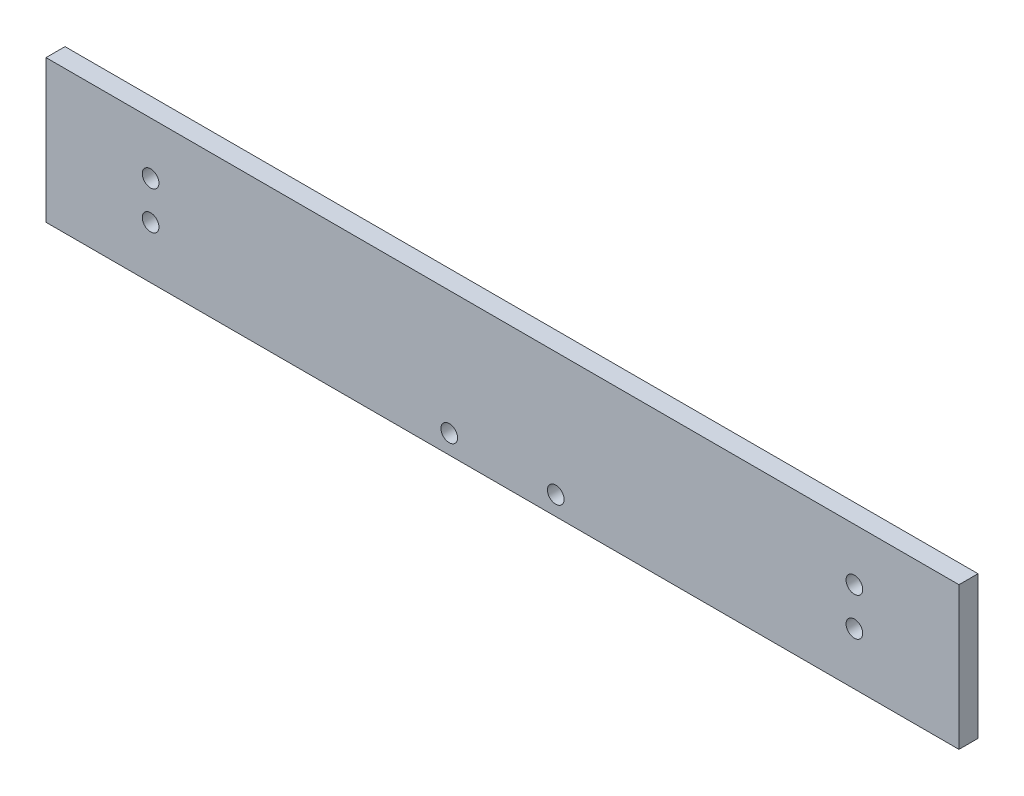
ISO-10303-21;
HEADER;
FILE_DESCRIPTION(('STEP AP214'),'2;1');
FILE_NAME('part.step','',(''),(''),'','','');
FILE_SCHEMA(('AUTOMOTIVE_DESIGN { 1 0 10303 214 1 1 1 1 }'));
ENDSEC;
DATA;
#1=APPLICATION_CONTEXT('core data for automotive mechanical design processes');
#2=APPLICATION_PROTOCOL_DEFINITION('international standard','automotive_design',2000,#1);
#3=PRODUCT_CONTEXT('',#1,'mechanical');
#4=PRODUCT('Part','Part','',(#3));
#5=PRODUCT_RELATED_PRODUCT_CATEGORY('part','',(#4));
#6=PRODUCT_DEFINITION_FORMATION('','',#4);
#7=PRODUCT_DEFINITION_CONTEXT('part definition',#1,'design');
#8=PRODUCT_DEFINITION('design','',#6,#7);
#9=PRODUCT_DEFINITION_SHAPE('','',#8);
#10=(LENGTH_UNIT() NAMED_UNIT(*) SI_UNIT(.MILLI.,.METRE.));
#11=(NAMED_UNIT(*) PLANE_ANGLE_UNIT() SI_UNIT($,.RADIAN.));
#12=(NAMED_UNIT(*) SI_UNIT($,.STERADIAN.) SOLID_ANGLE_UNIT());
#13=UNCERTAINTY_MEASURE_WITH_UNIT(LENGTH_MEASURE(1.E-05),#10,'distance_accuracy_value','');
#14=(GEOMETRIC_REPRESENTATION_CONTEXT(3) GLOBAL_UNCERTAINTY_ASSIGNED_CONTEXT((#13)) GLOBAL_UNIT_ASSIGNED_CONTEXT((#10,
#11,#12)) REPRESENTATION_CONTEXT('',''));
#15=CARTESIAN_POINT('',(0.,0.,0.));
#16=DIRECTION('',(0.,0.,1.));
#17=DIRECTION('',(1.,0.,0.));
#18=AXIS2_PLACEMENT_3D('',#15,#16,#17);
#19=CARTESIAN_POINT('',(-91.3947659491775,0.,4.));
#20=DIRECTION('',(-1.,0.,0.));
#21=DIRECTION('',(0.,0.,1.));
#22=AXIS2_PLACEMENT_3D('',#19,#20,#21);
#23=PLANE('',#22);
#24=DIRECTION('',(0.,1.,0.));
#25=VECTOR('',#24,1.);
#26=CARTESIAN_POINT('',(-91.3947659491775,0.,0.));
#27=LINE('',#26,#25);
#28=CARTESIAN_POINT('',(-91.3947659491775,-16.7611849929289,0.));
#29=VERTEX_POINT('',#28);
#30=CARTESIAN_POINT('',(-91.3947659491775,13.2388150070711,0.));
#31=VERTEX_POINT('',#30);
#32=EDGE_CURVE('E116',#29,#31,#27,.T.);
#33=ORIENTED_EDGE('',*,*,#32,.F.);
#34=DIRECTION('',(0.,0.,-1.));
#35=VECTOR('',#34,1.);
#36=CARTESIAN_POINT('',(-91.3947659491775,-16.7611849929289,4.));
#37=LINE('',#36,#35);
#38=CARTESIAN_POINT('',(-91.3947659491775,-16.7611849929289,4.));
#39=VERTEX_POINT('',#38);
#40=EDGE_CURVE('E11',#39,#29,#37,.T.);
#41=ORIENTED_EDGE('',*,*,#40,.F.);
#42=DIRECTION('',(0.,1.,0.));
#43=VECTOR('',#42,1.);
#44=CARTESIAN_POINT('',(-91.3947659491775,0.,4.));
#45=LINE('',#44,#43);
#46=CARTESIAN_POINT('',(-91.3947659491775,13.2388150070711,4.));
#47=VERTEX_POINT('',#46);
#48=EDGE_CURVE('E86',#39,#47,#45,.T.);
#49=ORIENTED_EDGE('',*,*,#48,.T.);
#50=DIRECTION('',(0.,0.,-1.));
#51=VECTOR('',#50,1.);
#52=CARTESIAN_POINT('',(-91.3947659491775,13.2388150070711,4.));
#53=LINE('',#52,#51);
#54=EDGE_CURVE('E74',#47,#31,#53,.T.);
#55=ORIENTED_EDGE('',*,*,#54,.T.);
#56=EDGE_LOOP('',(#33,#41,#49,#55));
#57=FACE_BOUND('',#56,.T.);
#58=ADVANCED_FACE('F35',(#57),#23,.T.);
#59=CARTESIAN_POINT('',(0.,-16.7611849929289,4.));
#60=DIRECTION('',(0.,1.,0.));
#61=DIRECTION('',(-1.,0.,0.));
#62=AXIS2_PLACEMENT_3D('',#59,#60,#61);
#63=PLANE('',#62);
#64=DIRECTION('',(1.,0.,0.));
#65=VECTOR('',#64,1.);
#66=CARTESIAN_POINT('',(0.,-16.7611849929289,0.));
#67=LINE('',#66,#65);
#68=CARTESIAN_POINT('',(100.605234050822,-16.7611849929288,0.));
#69=VERTEX_POINT('',#68);
#70=EDGE_CURVE('E91',#29,#69,#67,.T.);
#71=ORIENTED_EDGE('',*,*,#70,.T.);
#72=DIRECTION('',(0.,0.,-1.));
#73=VECTOR('',#72,1.);
#74=CARTESIAN_POINT('',(100.605234050822,-16.7611849929288,4.));
#75=LINE('',#74,#73);
#76=CARTESIAN_POINT('',(100.605234050822,-16.7611849929288,4.));
#77=VERTEX_POINT('',#76);
#78=EDGE_CURVE('E43',#77,#69,#75,.T.);
#79=ORIENTED_EDGE('',*,*,#78,.F.);
#80=DIRECTION('',(1.,0.,0.));
#81=VECTOR('',#80,1.);
#82=CARTESIAN_POINT('',(0.,-16.7611849929289,4.));
#83=LINE('',#82,#81);
#84=EDGE_CURVE('E80',#39,#77,#83,.T.);
#85=ORIENTED_EDGE('',*,*,#84,.F.);
#86=ORIENTED_EDGE('',*,*,#40,.T.);
#87=EDGE_LOOP('',(#71,#79,#85,#86));
#88=FACE_BOUND('',#87,.T.);
#89=ADVANCED_FACE('F89',(#88),#63,.F.);
#90=CARTESIAN_POINT('',(100.605234050822,0.,4.));
#91=DIRECTION('',(-1.,0.,0.));
#92=DIRECTION('',(0.,0.,1.));
#93=AXIS2_PLACEMENT_3D('',#90,#91,#92);
#94=PLANE('',#93);
#95=DIRECTION('',(0.,1.,0.));
#96=VECTOR('',#95,1.);
#97=CARTESIAN_POINT('',(100.605234050822,0.,0.));
#98=LINE('',#97,#96);
#99=CARTESIAN_POINT('',(100.605234050822,13.2388150070711,0.));
#100=VERTEX_POINT('',#99);
#101=EDGE_CURVE('E67',#69,#100,#98,.T.);
#102=ORIENTED_EDGE('',*,*,#101,.T.);
#103=DIRECTION('',(0.,0.,-1.));
#104=VECTOR('',#103,1.);
#105=CARTESIAN_POINT('',(100.605234050822,13.2388150070711,4.));
#106=LINE('',#105,#104);
#107=CARTESIAN_POINT('',(100.605234050822,13.2388150070711,4.));
#108=VERTEX_POINT('',#107);
#109=EDGE_CURVE('E92',#108,#100,#106,.T.);
#110=ORIENTED_EDGE('',*,*,#109,.F.);
#111=DIRECTION('',(0.,1.,0.));
#112=VECTOR('',#111,1.);
#113=CARTESIAN_POINT('',(100.605234050822,0.,4.));
#114=LINE('',#113,#112);
#115=EDGE_CURVE('E85',#77,#108,#114,.T.);
#116=ORIENTED_EDGE('',*,*,#115,.F.);
#117=ORIENTED_EDGE('',*,*,#78,.T.);
#118=EDGE_LOOP('',(#102,#110,#116,#117));
#119=FACE_BOUND('',#118,.T.);
#120=ADVANCED_FACE('F93',(#119),#94,.F.);
#121=CARTESIAN_POINT('',(15.8052340508226,-12.7611849929288,4.));
#122=DIRECTION('',(0.,0.,-1.));
#123=DIRECTION('',(-1.,0.,0.));
#124=AXIS2_PLACEMENT_3D('',#121,#122,#123);
#125=CYLINDRICAL_SURFACE('',#124,1.75000000000001);
#126=CARTESIAN_POINT('',(15.8052340508226,-12.7611849929288,4.));
#127=DIRECTION('',(0.,0.,1.));
#128=DIRECTION('',(1.,0.,0.));
#129=AXIS2_PLACEMENT_3D('',#126,#127,#128);
#130=CIRCLE('',#129,1.75000000000001);
#131=CARTESIAN_POINT('',(17.5552340508226,-12.7611849929288,4.));
#132=VERTEX_POINT('',#131);
#133=EDGE_CURVE('E110',#132,#132,#130,.T.);
#134=ORIENTED_EDGE('',*,*,#133,.T.);
#135=EDGE_LOOP('',(#134));
#136=FACE_BOUND('',#135,.T.);
#137=CARTESIAN_POINT('',(15.8052340508226,-12.7611849929288,0.));
#138=DIRECTION('',(0.,0.,1.));
#139=DIRECTION('',(1.,0.,0.));
#140=AXIS2_PLACEMENT_3D('',#137,#138,#139);
#141=CIRCLE('',#140,1.75000000000001);
#142=CARTESIAN_POINT('',(17.5552340508226,-12.7611849929288,0.));
#143=VERTEX_POINT('',#142);
#144=EDGE_CURVE('E135',#143,#143,#141,.T.);
#145=ORIENTED_EDGE('',*,*,#144,.F.);
#146=EDGE_LOOP('',(#145));
#147=FACE_BOUND('',#146,.T.);
#148=ADVANCED_FACE('F155',(#136,#147),#125,.F.);
#149=CARTESIAN_POINT('',(-69.3947659491773,2.23881500707113,4.));
#150=DIRECTION('',(0.,0.,-1.));
#151=DIRECTION('',(-1.,0.,0.));
#152=AXIS2_PLACEMENT_3D('',#149,#150,#151);
#153=CYLINDRICAL_SURFACE('',#152,1.74999999999998);
#154=CARTESIAN_POINT('',(-69.3947659491773,2.23881500707113,4.));
#155=DIRECTION('',(0.,0.,1.));
#156=DIRECTION('',(1.,0.,0.));
#157=AXIS2_PLACEMENT_3D('',#154,#155,#156);
#158=CIRCLE('',#157,1.74999999999998);
#159=CARTESIAN_POINT('',(-67.6447659491774,2.23881500707113,4.));
#160=VERTEX_POINT('',#159);
#161=EDGE_CURVE('E107',#160,#160,#158,.F.);
#162=ORIENTED_EDGE('',*,*,#161,.F.);
#163=EDGE_LOOP('',(#162));
#164=FACE_BOUND('',#163,.T.);
#165=CARTESIAN_POINT('',(-69.3947659491773,2.23881500707113,0.));
#166=DIRECTION('',(0.,0.,1.));
#167=DIRECTION('',(1.,0.,0.));
#168=AXIS2_PLACEMENT_3D('',#165,#166,#167);
#169=CIRCLE('',#168,1.74999999999998);
#170=CARTESIAN_POINT('',(-67.6447659491774,2.23881500707113,0.));
#171=VERTEX_POINT('',#170);
#172=EDGE_CURVE('E132',#171,#171,#169,.F.);
#173=ORIENTED_EDGE('',*,*,#172,.T.);
#174=EDGE_LOOP('',(#173));
#175=FACE_BOUND('',#174,.T.);
#176=ADVANCED_FACE('F172',(#164,#175),#153,.F.);
#177=CARTESIAN_POINT('',(78.6052340508225,-5.76118499292888,4.));
#178=DIRECTION('',(0.,0.,-1.));
#179=DIRECTION('',(-1.,0.,0.));
#180=AXIS2_PLACEMENT_3D('',#177,#178,#179);
#181=CYLINDRICAL_SURFACE('',#180,1.74999999999998);
#182=CARTESIAN_POINT('',(78.6052340508225,-5.76118499292888,4.));
#183=DIRECTION('',(0.,0.,1.));
#184=DIRECTION('',(1.,0.,0.));
#185=AXIS2_PLACEMENT_3D('',#182,#183,#184);
#186=CIRCLE('',#185,1.74999999999998);
#187=CARTESIAN_POINT('',(80.3552340508224,-5.76118499292888,4.));
#188=VERTEX_POINT('',#187);
#189=EDGE_CURVE('E104',#188,#188,#186,.T.);
#190=ORIENTED_EDGE('',*,*,#189,.T.);
#191=EDGE_LOOP('',(#190));
#192=FACE_BOUND('',#191,.T.);
#193=CARTESIAN_POINT('',(78.6052340508225,-5.76118499292888,0.));
#194=DIRECTION('',(0.,0.,1.));
#195=DIRECTION('',(1.,0.,0.));
#196=AXIS2_PLACEMENT_3D('',#193,#194,#195);
#197=CIRCLE('',#196,1.74999999999998);
#198=CARTESIAN_POINT('',(80.3552340508224,-5.76118499292888,0.));
#199=VERTEX_POINT('',#198);
#200=EDGE_CURVE('E129',#199,#199,#197,.T.);
#201=ORIENTED_EDGE('',*,*,#200,.F.);
#202=EDGE_LOOP('',(#201));
#203=FACE_BOUND('',#202,.T.);
#204=ADVANCED_FACE('F168',(#192,#203),#181,.F.);
#205=CARTESIAN_POINT('',(78.6052340508225,2.23881500707113,4.));
#206=DIRECTION('',(0.,0.,-1.));
#207=DIRECTION('',(-1.,0.,0.));
#208=AXIS2_PLACEMENT_3D('',#205,#206,#207);
#209=CYLINDRICAL_SURFACE('',#208,1.74999999999998);
#210=CARTESIAN_POINT('',(78.6052340508225,2.23881500707113,4.));
#211=DIRECTION('',(0.,0.,1.));
#212=DIRECTION('',(1.,0.,0.));
#213=AXIS2_PLACEMENT_3D('',#210,#211,#212);
#214=CIRCLE('',#213,1.74999999999998);
#215=CARTESIAN_POINT('',(80.3552340508224,2.23881500707113,4.));
#216=VERTEX_POINT('',#215);
#217=EDGE_CURVE('E101',#216,#216,#214,.T.);
#218=ORIENTED_EDGE('',*,*,#217,.T.);
#219=EDGE_LOOP('',(#218));
#220=FACE_BOUND('',#219,.T.);
#221=CARTESIAN_POINT('',(78.6052340508225,2.23881500707113,0.));
#222=DIRECTION('',(0.,0.,1.));
#223=DIRECTION('',(1.,0.,0.));
#224=AXIS2_PLACEMENT_3D('',#221,#222,#223);
#225=CIRCLE('',#224,1.74999999999998);
#226=CARTESIAN_POINT('',(80.3552340508224,2.23881500707113,0.));
#227=VERTEX_POINT('',#226);
#228=EDGE_CURVE('E126',#227,#227,#225,.T.);
#229=ORIENTED_EDGE('',*,*,#228,.F.);
#230=EDGE_LOOP('',(#229));
#231=FACE_BOUND('',#230,.T.);
#232=ADVANCED_FACE('F164',(#220,#231),#209,.F.);
#233=CARTESIAN_POINT('',(-69.3947659491773,-5.76118499292888,4.));
#234=DIRECTION('',(0.,0.,-1.));
#235=DIRECTION('',(-1.,0.,0.));
#236=AXIS2_PLACEMENT_3D('',#233,#234,#235);
#237=CYLINDRICAL_SURFACE('',#236,1.74999999999998);
#238=CARTESIAN_POINT('',(-69.3947659491773,-5.76118499292888,4.));
#239=DIRECTION('',(0.,0.,1.));
#240=DIRECTION('',(1.,0.,0.));
#241=AXIS2_PLACEMENT_3D('',#238,#239,#240);
#242=CIRCLE('',#241,1.74999999999998);
#243=CARTESIAN_POINT('',(-67.6447659491774,-5.76118499292888,4.));
#244=VERTEX_POINT('',#243);
#245=EDGE_CURVE('E95',#244,#244,#242,.F.);
#246=ORIENTED_EDGE('',*,*,#245,.F.);
#247=EDGE_LOOP('',(#246));
#248=FACE_BOUND('',#247,.T.);
#249=CARTESIAN_POINT('',(-69.3947659491773,-5.76118499292888,0.));
#250=DIRECTION('',(0.,0.,1.));
#251=DIRECTION('',(1.,0.,0.));
#252=AXIS2_PLACEMENT_3D('',#249,#250,#251);
#253=CIRCLE('',#252,1.74999999999998);
#254=CARTESIAN_POINT('',(-67.6447659491774,-5.76118499292888,0.));
#255=VERTEX_POINT('',#254);
#256=EDGE_CURVE('E123',#255,#255,#253,.F.);
#257=ORIENTED_EDGE('',*,*,#256,.T.);
#258=EDGE_LOOP('',(#257));
#259=FACE_BOUND('',#258,.T.);
#260=ADVANCED_FACE('F161',(#248,#259),#237,.F.);
#261=CARTESIAN_POINT('',(0.,13.2388150070711,4.));
#262=DIRECTION('',(0.,-1.,0.));
#263=DIRECTION('',(1.,0.,0.));
#264=AXIS2_PLACEMENT_3D('',#261,#262,#263);
#265=PLANE('',#264);
#266=DIRECTION('',(-1.,0.,0.));
#267=VECTOR('',#266,1.);
#268=CARTESIAN_POINT('',(0.,13.2388150070711,0.));
#269=LINE('',#268,#267);
#270=EDGE_CURVE('E121',#100,#31,#269,.T.);
#271=ORIENTED_EDGE('',*,*,#270,.T.);
#272=ORIENTED_EDGE('',*,*,#54,.F.);
#273=DIRECTION('',(-1.,0.,0.));
#274=VECTOR('',#273,1.);
#275=CARTESIAN_POINT('',(0.,13.2388150070711,4.));
#276=LINE('',#275,#274);
#277=EDGE_CURVE('E51',#108,#47,#276,.T.);
#278=ORIENTED_EDGE('',*,*,#277,.F.);
#279=ORIENTED_EDGE('',*,*,#109,.T.);
#280=EDGE_LOOP('',(#271,#272,#278,#279));
#281=FACE_BOUND('',#280,.T.);
#282=ADVANCED_FACE('F144',(#281),#265,.F.);
#283=CARTESIAN_POINT('',(-6.59476594917741,-12.7611849929288,4.));
#284=DIRECTION('',(0.,0.,-1.));
#285=DIRECTION('',(-1.,0.,0.));
#286=AXIS2_PLACEMENT_3D('',#283,#284,#285);
#287=CYLINDRICAL_SURFACE('',#286,1.75);
#288=CARTESIAN_POINT('',(-6.59476594917741,-12.7611849929288,4.));
#289=DIRECTION('',(0.,0.,1.));
#290=DIRECTION('',(1.,0.,0.));
#291=AXIS2_PLACEMENT_3D('',#288,#289,#290);
#292=CIRCLE('',#291,1.75);
#293=CARTESIAN_POINT('',(-4.84476594917741,-12.7611849929288,4.));
#294=VERTEX_POINT('',#293);
#295=EDGE_CURVE('E113',#294,#294,#292,.T.);
#296=ORIENTED_EDGE('',*,*,#295,.T.);
#297=EDGE_LOOP('',(#296));
#298=FACE_BOUND('',#297,.T.);
#299=CARTESIAN_POINT('',(-6.59476594917741,-12.7611849929288,0.));
#300=DIRECTION('',(0.,0.,1.));
#301=DIRECTION('',(1.,0.,0.));
#302=AXIS2_PLACEMENT_3D('',#299,#300,#301);
#303=CIRCLE('',#302,1.75);
#304=CARTESIAN_POINT('',(-4.84476594917741,-12.7611849929288,0.));
#305=VERTEX_POINT('',#304);
#306=EDGE_CURVE('E138',#305,#305,#303,.T.);
#307=ORIENTED_EDGE('',*,*,#306,.F.);
#308=EDGE_LOOP('',(#307));
#309=FACE_BOUND('',#308,.T.);
#310=ADVANCED_FACE('F160',(#298,#309),#287,.F.);
#311=CARTESIAN_POINT('',(0.,0.,4.));
#312=DIRECTION('',(0.,0.,1.));
#313=DIRECTION('',(1.,0.,0.));
#314=AXIS2_PLACEMENT_3D('',#311,#312,#313);
#315=PLANE('',#314);
#316=ORIENTED_EDGE('',*,*,#48,.F.);
#317=ORIENTED_EDGE('',*,*,#84,.T.);
#318=ORIENTED_EDGE('',*,*,#115,.T.);
#319=ORIENTED_EDGE('',*,*,#277,.T.);
#320=EDGE_LOOP('',(#316,#317,#318,#319));
#321=FACE_BOUND('',#320,.T.);
#322=ORIENTED_EDGE('',*,*,#245,.T.);
#323=EDGE_LOOP('',(#322));
#324=FACE_BOUND('',#323,.T.);
#325=ORIENTED_EDGE('',*,*,#217,.F.);
#326=EDGE_LOOP('',(#325));
#327=FACE_BOUND('',#326,.T.);
#328=ORIENTED_EDGE('',*,*,#189,.F.);
#329=EDGE_LOOP('',(#328));
#330=FACE_BOUND('',#329,.T.);
#331=ORIENTED_EDGE('',*,*,#161,.T.);
#332=EDGE_LOOP('',(#331));
#333=FACE_BOUND('',#332,.T.);
#334=ORIENTED_EDGE('',*,*,#133,.F.);
#335=EDGE_LOOP('',(#334));
#336=FACE_BOUND('',#335,.T.);
#337=ORIENTED_EDGE('',*,*,#295,.F.);
#338=EDGE_LOOP('',(#337));
#339=FACE_BOUND('',#338,.T.);
#340=ADVANCED_FACE('F82',(#321,#324,#327,#330,#333,#336,#339),#315,.T.);
#341=CARTESIAN_POINT('',(0.,0.,0.));
#342=DIRECTION('',(0.,0.,1.));
#343=DIRECTION('',(1.,0.,0.));
#344=AXIS2_PLACEMENT_3D('',#341,#342,#343);
#345=PLANE('',#344);
#346=ORIENTED_EDGE('',*,*,#32,.T.);
#347=ORIENTED_EDGE('',*,*,#270,.F.);
#348=ORIENTED_EDGE('',*,*,#101,.F.);
#349=ORIENTED_EDGE('',*,*,#70,.F.);
#350=EDGE_LOOP('',(#346,#347,#348,#349));
#351=FACE_BOUND('',#350,.T.);
#352=ORIENTED_EDGE('',*,*,#256,.F.);
#353=EDGE_LOOP('',(#352));
#354=FACE_BOUND('',#353,.T.);
#355=ORIENTED_EDGE('',*,*,#228,.T.);
#356=EDGE_LOOP('',(#355));
#357=FACE_BOUND('',#356,.T.);
#358=ORIENTED_EDGE('',*,*,#200,.T.);
#359=EDGE_LOOP('',(#358));
#360=FACE_BOUND('',#359,.T.);
#361=ORIENTED_EDGE('',*,*,#172,.F.);
#362=EDGE_LOOP('',(#361));
#363=FACE_BOUND('',#362,.T.);
#364=ORIENTED_EDGE('',*,*,#144,.T.);
#365=EDGE_LOOP('',(#364));
#366=FACE_BOUND('',#365,.T.);
#367=ORIENTED_EDGE('',*,*,#306,.T.);
#368=EDGE_LOOP('',(#367));
#369=FACE_BOUND('',#368,.T.);
#370=ADVANCED_FACE('F146',(#351,#354,#357,#360,#363,#366,#369),#345,.F.);
#371=CLOSED_SHELL('',(#58,#89,#120,#148,#176,#204,#232,#260,#282,#310,#340,#370));
#372=MANIFOLD_SOLID_BREP('B2',#371);
#373=ADVANCED_BREP_SHAPE_REPRESENTATION('',(#18,#372),#14);
#374=SHAPE_DEFINITION_REPRESENTATION(#9,#373);
ENDSEC;
END-ISO-10303-21;
